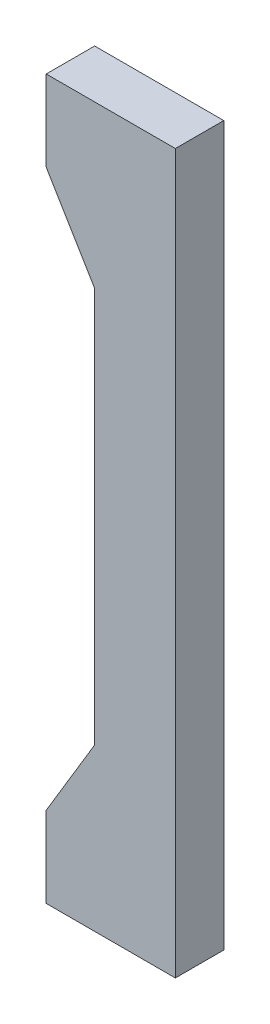
ISO-10303-21;
HEADER;
FILE_DESCRIPTION(('STEP AP214'),'2;1');
FILE_NAME('part.step','',(''),(''),'','','');
FILE_SCHEMA(('AUTOMOTIVE_DESIGN { 1 0 10303 214 1 1 1 1 }'));
ENDSEC;
DATA;
#1=APPLICATION_CONTEXT('core data for automotive mechanical design processes');
#2=APPLICATION_PROTOCOL_DEFINITION('international standard','automotive_design',2000,#1);
#3=PRODUCT_CONTEXT('',#1,'mechanical');
#4=PRODUCT('Part','Part','',(#3));
#5=PRODUCT_RELATED_PRODUCT_CATEGORY('part','',(#4));
#6=PRODUCT_DEFINITION_FORMATION('','',#4);
#7=PRODUCT_DEFINITION_CONTEXT('part definition',#1,'design');
#8=PRODUCT_DEFINITION('design','',#6,#7);
#9=PRODUCT_DEFINITION_SHAPE('','',#8);
#10=(LENGTH_UNIT() NAMED_UNIT(*) SI_UNIT(.MILLI.,.METRE.));
#11=(NAMED_UNIT(*) PLANE_ANGLE_UNIT() SI_UNIT($,.RADIAN.));
#12=(NAMED_UNIT(*) SI_UNIT($,.STERADIAN.) SOLID_ANGLE_UNIT());
#13=UNCERTAINTY_MEASURE_WITH_UNIT(LENGTH_MEASURE(1.E-05),#10,'distance_accuracy_value','');
#14=(GEOMETRIC_REPRESENTATION_CONTEXT(3) GLOBAL_UNCERTAINTY_ASSIGNED_CONTEXT((#13)) GLOBAL_UNIT_ASSIGNED_CONTEXT((#10,
#11,#12)) REPRESENTATION_CONTEXT('',''));
#15=CARTESIAN_POINT('',(0.,0.,0.));
#16=DIRECTION('',(0.,0.,1.));
#17=DIRECTION('',(1.,0.,0.));
#18=AXIS2_PLACEMENT_3D('',#15,#16,#17);
#19=CARTESIAN_POINT('',(-80.,172.5,15.));
#20=DIRECTION('',(0.857492925712544,0.514495755427527,0.));
#21=DIRECTION('',(-0.514495755427527,0.857492925712544,0.));
#22=AXIS2_PLACEMENT_3D('',#19,#20,#21);
#23=PLANE('',#22);
#24=DIRECTION('',(0.514495755427527,-0.857492925712544,0.));
#25=VECTOR('',#24,1.);
#26=CARTESIAN_POINT('',(-80.,172.5,-15.));
#27=LINE('',#26,#25);
#28=CARTESIAN_POINT('',(-80.,172.5,-15.));
#29=VERTEX_POINT('',#28);
#30=CARTESIAN_POINT('',(-50.,122.5,-15.));
#31=VERTEX_POINT('',#30);
#32=EDGE_CURVE('E131',#29,#31,#27,.T.);
#33=ORIENTED_EDGE('',*,*,#32,.T.);
#34=DIRECTION('',(0.,0.,-1.));
#35=VECTOR('',#34,1.);
#36=CARTESIAN_POINT('',(-50.,122.5,15.));
#37=LINE('',#36,#35);
#38=CARTESIAN_POINT('',(-50.,122.5,15.));
#39=VERTEX_POINT('',#38);
#40=EDGE_CURVE('E11',#39,#31,#37,.T.);
#41=ORIENTED_EDGE('',*,*,#40,.F.);
#42=DIRECTION('',(0.514495755427527,-0.857492925712544,0.));
#43=VECTOR('',#42,1.);
#44=CARTESIAN_POINT('',(-80.,172.5,15.));
#45=LINE('',#44,#43);
#46=CARTESIAN_POINT('',(-80.,172.5,15.));
#47=VERTEX_POINT('',#46);
#48=EDGE_CURVE('E150',#47,#39,#45,.T.);
#49=ORIENTED_EDGE('',*,*,#48,.F.);
#50=DIRECTION('',(0.,0.,-1.));
#51=VECTOR('',#50,1.);
#52=CARTESIAN_POINT('',(-80.,172.5,15.));
#53=LINE('',#52,#51);
#54=EDGE_CURVE('E127',#47,#29,#53,.T.);
#55=ORIENTED_EDGE('',*,*,#54,.T.);
#56=EDGE_LOOP('',(#33,#41,#49,#55));
#57=FACE_BOUND('',#56,.T.);
#58=ADVANCED_FACE('F36',(#57),#23,.F.);
#59=CARTESIAN_POINT('',(-50.,122.5,15.));
#60=DIRECTION('',(1.,0.,0.));
#61=DIRECTION('',(0.,0.,-1.));
#62=AXIS2_PLACEMENT_3D('',#59,#60,#61);
#63=PLANE('',#62);
#64=DIRECTION('',(0.,-1.,0.));
#65=VECTOR('',#64,1.);
#66=CARTESIAN_POINT('',(-50.,122.5,-15.));
#67=LINE('',#66,#65);
#68=CARTESIAN_POINT('',(-50.,-122.5,-15.));
#69=VERTEX_POINT('',#68);
#70=EDGE_CURVE('E134',#31,#69,#67,.T.);
#71=ORIENTED_EDGE('',*,*,#70,.T.);
#72=DIRECTION('',(0.,0.,-1.));
#73=VECTOR('',#72,1.);
#74=CARTESIAN_POINT('',(-50.,-122.5,15.));
#75=LINE('',#74,#73);
#76=CARTESIAN_POINT('',(-50.,-122.5,15.));
#77=VERTEX_POINT('',#76);
#78=EDGE_CURVE('E44',#77,#69,#75,.T.);
#79=ORIENTED_EDGE('',*,*,#78,.F.);
#80=DIRECTION('',(0.,-1.,0.));
#81=VECTOR('',#80,1.);
#82=CARTESIAN_POINT('',(-50.,122.5,15.));
#83=LINE('',#82,#81);
#84=EDGE_CURVE('E91',#39,#77,#83,.T.);
#85=ORIENTED_EDGE('',*,*,#84,.F.);
#86=ORIENTED_EDGE('',*,*,#40,.T.);
#87=EDGE_LOOP('',(#71,#79,#85,#86));
#88=FACE_BOUND('',#87,.T.);
#89=ADVANCED_FACE('F163',(#88),#63,.F.);
#90=CARTESIAN_POINT('',(-80.,-172.5,15.));
#91=DIRECTION('',(-0.857492925712544,0.514495755427527,0.));
#92=DIRECTION('',(-0.514495755427527,-0.857492925712544,0.));
#93=AXIS2_PLACEMENT_3D('',#90,#91,#92);
#94=PLANE('',#93);
#95=DIRECTION('',(0.514495755427527,0.857492925712544,0.));
#96=VECTOR('',#95,1.);
#97=CARTESIAN_POINT('',(-80.,-172.5,-15.));
#98=LINE('',#97,#96);
#99=CARTESIAN_POINT('',(-80.,-172.5,-15.));
#100=VERTEX_POINT('',#99);
#101=EDGE_CURVE('E137',#100,#69,#98,.T.);
#102=ORIENTED_EDGE('',*,*,#101,.F.);
#103=DIRECTION('',(0.,0.,-1.));
#104=VECTOR('',#103,1.);
#105=CARTESIAN_POINT('',(-80.,-172.5,15.));
#106=LINE('',#105,#104);
#107=CARTESIAN_POINT('',(-80.,-172.5,15.));
#108=VERTEX_POINT('',#107);
#109=EDGE_CURVE('E156',#108,#100,#106,.T.);
#110=ORIENTED_EDGE('',*,*,#109,.F.);
#111=DIRECTION('',(0.514495755427527,0.857492925712544,0.));
#112=VECTOR('',#111,1.);
#113=CARTESIAN_POINT('',(-80.,-172.5,15.));
#114=LINE('',#113,#112);
#115=EDGE_CURVE('E162',#108,#77,#114,.T.);
#116=ORIENTED_EDGE('',*,*,#115,.T.);
#117=ORIENTED_EDGE('',*,*,#78,.T.);
#118=EDGE_LOOP('',(#102,#110,#116,#117));
#119=FACE_BOUND('',#118,.T.);
#120=ADVANCED_FACE('F160',(#119),#94,.T.);
#121=CARTESIAN_POINT('',(-80.,-222.5,15.));
#122=DIRECTION('',(-1.,0.,0.));
#123=DIRECTION('',(0.,0.,1.));
#124=AXIS2_PLACEMENT_3D('',#121,#122,#123);
#125=PLANE('',#124);
#126=DIRECTION('',(0.,1.,0.));
#127=VECTOR('',#126,1.);
#128=CARTESIAN_POINT('',(-80.,-222.5,-15.));
#129=LINE('',#128,#127);
#130=CARTESIAN_POINT('',(-80.,-222.5,-15.));
#131=VERTEX_POINT('',#130);
#132=EDGE_CURVE('E140',#131,#100,#129,.T.);
#133=ORIENTED_EDGE('',*,*,#132,.F.);
#134=DIRECTION('',(0.,0.,-1.));
#135=VECTOR('',#134,1.);
#136=CARTESIAN_POINT('',(-80.,-222.5,15.));
#137=LINE('',#136,#135);
#138=CARTESIAN_POINT('',(-80.,-222.5,15.));
#139=VERTEX_POINT('',#138);
#140=EDGE_CURVE('E154',#139,#131,#137,.T.);
#141=ORIENTED_EDGE('',*,*,#140,.F.);
#142=DIRECTION('',(0.,1.,0.));
#143=VECTOR('',#142,1.);
#144=CARTESIAN_POINT('',(-80.,-222.5,15.));
#145=LINE('',#144,#143);
#146=EDGE_CURVE('E173',#139,#108,#145,.T.);
#147=ORIENTED_EDGE('',*,*,#146,.T.);
#148=ORIENTED_EDGE('',*,*,#109,.T.);
#149=EDGE_LOOP('',(#133,#141,#147,#148));
#150=FACE_BOUND('',#149,.T.);
#151=ADVANCED_FACE('F171',(#150),#125,.T.);
#152=CARTESIAN_POINT('',(-80.,-222.5,15.));
#153=DIRECTION('',(0.,1.,0.));
#154=DIRECTION('',(0.,0.,1.));
#155=AXIS2_PLACEMENT_3D('',#152,#153,#154);
#156=PLANE('',#155);
#157=DIRECTION('',(1.,0.,0.));
#158=VECTOR('',#157,1.);
#159=CARTESIAN_POINT('',(-80.,-222.5,-15.));
#160=LINE('',#159,#158);
#161=CARTESIAN_POINT('',(0.,-222.5,-15.));
#162=VERTEX_POINT('',#161);
#163=EDGE_CURVE('E143',#131,#162,#160,.T.);
#164=ORIENTED_EDGE('',*,*,#163,.T.);
#165=DIRECTION('',(0.,0.,-1.));
#166=VECTOR('',#165,1.);
#167=CARTESIAN_POINT('',(0.,-222.5,15.));
#168=LINE('',#167,#166);
#169=CARTESIAN_POINT('',(0.,-222.5,15.));
#170=VERTEX_POINT('',#169);
#171=EDGE_CURVE('E116',#170,#162,#168,.T.);
#172=ORIENTED_EDGE('',*,*,#171,.F.);
#173=DIRECTION('',(1.,0.,0.));
#174=VECTOR('',#173,1.);
#175=CARTESIAN_POINT('',(-80.,-222.5,15.));
#176=LINE('',#175,#174);
#177=EDGE_CURVE('E122',#139,#170,#176,.T.);
#178=ORIENTED_EDGE('',*,*,#177,.F.);
#179=ORIENTED_EDGE('',*,*,#140,.T.);
#180=EDGE_LOOP('',(#164,#172,#178,#179));
#181=FACE_BOUND('',#180,.T.);
#182=ADVANCED_FACE('F201',(#181),#156,.F.);
#183=CARTESIAN_POINT('',(0.,222.5,15.));
#184=DIRECTION('',(1.,0.,0.));
#185=DIRECTION('',(0.,0.,-1.));
#186=AXIS2_PLACEMENT_3D('',#183,#184,#185);
#187=PLANE('',#186);
#188=DIRECTION('',(0.,-1.,0.));
#189=VECTOR('',#188,1.);
#190=CARTESIAN_POINT('',(0.,222.5,-15.));
#191=LINE('',#190,#189);
#192=CARTESIAN_POINT('',(0.,222.5,-15.));
#193=VERTEX_POINT('',#192);
#194=EDGE_CURVE('E111',#193,#162,#191,.T.);
#195=ORIENTED_EDGE('',*,*,#194,.F.);
#196=DIRECTION('',(0.,0.,-1.));
#197=VECTOR('',#196,1.);
#198=CARTESIAN_POINT('',(0.,222.5,15.));
#199=LINE('',#198,#197);
#200=CARTESIAN_POINT('',(0.,222.5,15.));
#201=VERTEX_POINT('',#200);
#202=EDGE_CURVE('E106',#201,#193,#199,.T.);
#203=ORIENTED_EDGE('',*,*,#202,.F.);
#204=DIRECTION('',(0.,-1.,0.));
#205=VECTOR('',#204,1.);
#206=CARTESIAN_POINT('',(0.,222.5,15.));
#207=LINE('',#206,#205);
#208=EDGE_CURVE('E109',#201,#170,#207,.T.);
#209=ORIENTED_EDGE('',*,*,#208,.T.);
#210=ORIENTED_EDGE('',*,*,#171,.T.);
#211=EDGE_LOOP('',(#195,#203,#209,#210));
#212=FACE_BOUND('',#211,.T.);
#213=ADVANCED_FACE('F108',(#212),#187,.T.);
#214=CARTESIAN_POINT('',(-80.,222.5,15.));
#215=DIRECTION('',(0.,1.,0.));
#216=DIRECTION('',(0.,0.,1.));
#217=AXIS2_PLACEMENT_3D('',#214,#215,#216);
#218=PLANE('',#217);
#219=DIRECTION('',(1.,0.,0.));
#220=VECTOR('',#219,1.);
#221=CARTESIAN_POINT('',(-80.,222.5,-15.));
#222=LINE('',#221,#220);
#223=CARTESIAN_POINT('',(-80.,222.5,-15.));
#224=VERTEX_POINT('',#223);
#225=EDGE_CURVE('E147',#224,#193,#222,.T.);
#226=ORIENTED_EDGE('',*,*,#225,.F.);
#227=DIRECTION('',(0.,0.,-1.));
#228=VECTOR('',#227,1.);
#229=CARTESIAN_POINT('',(-80.,222.5,15.));
#230=LINE('',#229,#228);
#231=CARTESIAN_POINT('',(-80.,222.5,15.));
#232=VERTEX_POINT('',#231);
#233=EDGE_CURVE('E80',#232,#224,#230,.T.);
#234=ORIENTED_EDGE('',*,*,#233,.F.);
#235=DIRECTION('',(1.,0.,0.));
#236=VECTOR('',#235,1.);
#237=CARTESIAN_POINT('',(-80.,222.5,15.));
#238=LINE('',#237,#236);
#239=EDGE_CURVE('E119',#232,#201,#238,.T.);
#240=ORIENTED_EDGE('',*,*,#239,.T.);
#241=ORIENTED_EDGE('',*,*,#202,.T.);
#242=EDGE_LOOP('',(#226,#234,#240,#241));
#243=FACE_BOUND('',#242,.T.);
#244=ADVANCED_FACE('F125',(#243),#218,.T.);
#245=CARTESIAN_POINT('',(-80.,222.5,15.));
#246=DIRECTION('',(1.,0.,0.));
#247=DIRECTION('',(0.,0.,-1.));
#248=AXIS2_PLACEMENT_3D('',#245,#246,#247);
#249=PLANE('',#248);
#250=DIRECTION('',(0.,-1.,0.));
#251=VECTOR('',#250,1.);
#252=CARTESIAN_POINT('',(-80.,222.5,-15.));
#253=LINE('',#252,#251);
#254=EDGE_CURVE('E83',#224,#29,#253,.T.);
#255=ORIENTED_EDGE('',*,*,#254,.T.);
#256=ORIENTED_EDGE('',*,*,#54,.F.);
#257=DIRECTION('',(0.,-1.,0.));
#258=VECTOR('',#257,1.);
#259=CARTESIAN_POINT('',(-80.,222.5,15.));
#260=LINE('',#259,#258);
#261=EDGE_CURVE('E52',#232,#47,#260,.T.);
#262=ORIENTED_EDGE('',*,*,#261,.F.);
#263=ORIENTED_EDGE('',*,*,#233,.T.);
#264=EDGE_LOOP('',(#255,#256,#262,#263));
#265=FACE_BOUND('',#264,.T.);
#266=ADVANCED_FACE('F180',(#265),#249,.F.);
#267=CARTESIAN_POINT('',(0.,0.,15.));
#268=DIRECTION('',(0.,0.,1.));
#269=DIRECTION('',(1.,0.,0.));
#270=AXIS2_PLACEMENT_3D('',#267,#268,#269);
#271=PLANE('',#270);
#272=ORIENTED_EDGE('',*,*,#48,.T.);
#273=ORIENTED_EDGE('',*,*,#84,.T.);
#274=ORIENTED_EDGE('',*,*,#115,.F.);
#275=ORIENTED_EDGE('',*,*,#146,.F.);
#276=ORIENTED_EDGE('',*,*,#177,.T.);
#277=ORIENTED_EDGE('',*,*,#208,.F.);
#278=ORIENTED_EDGE('',*,*,#239,.F.);
#279=ORIENTED_EDGE('',*,*,#261,.T.);
#280=EDGE_LOOP('',(#272,#273,#274,#275,#276,#277,#278,#279));
#281=FACE_BOUND('',#280,.T.);
#282=ADVANCED_FACE('F118',(#281),#271,.T.);
#283=CARTESIAN_POINT('',(0.,0.,-15.));
#284=DIRECTION('',(0.,0.,1.));
#285=DIRECTION('',(1.,0.,0.));
#286=AXIS2_PLACEMENT_3D('',#283,#284,#285);
#287=PLANE('',#286);
#288=ORIENTED_EDGE('',*,*,#32,.F.);
#289=ORIENTED_EDGE('',*,*,#254,.F.);
#290=ORIENTED_EDGE('',*,*,#225,.T.);
#291=ORIENTED_EDGE('',*,*,#194,.T.);
#292=ORIENTED_EDGE('',*,*,#163,.F.);
#293=ORIENTED_EDGE('',*,*,#132,.T.);
#294=ORIENTED_EDGE('',*,*,#101,.T.);
#295=ORIENTED_EDGE('',*,*,#70,.F.);
#296=EDGE_LOOP('',(#288,#289,#290,#291,#292,#293,#294,#295));
#297=FACE_BOUND('',#296,.T.);
#298=ADVANCED_FACE('F167',(#297),#287,.F.);
#299=CLOSED_SHELL('',(#58,#89,#120,#151,#182,#213,#244,#266,#282,#298));
#300=MANIFOLD_SOLID_BREP('B2',#299);
#301=ADVANCED_BREP_SHAPE_REPRESENTATION('',(#18,#300),#14);
#302=SHAPE_DEFINITION_REPRESENTATION(#9,#301);
ENDSEC;
END-ISO-10303-21;
